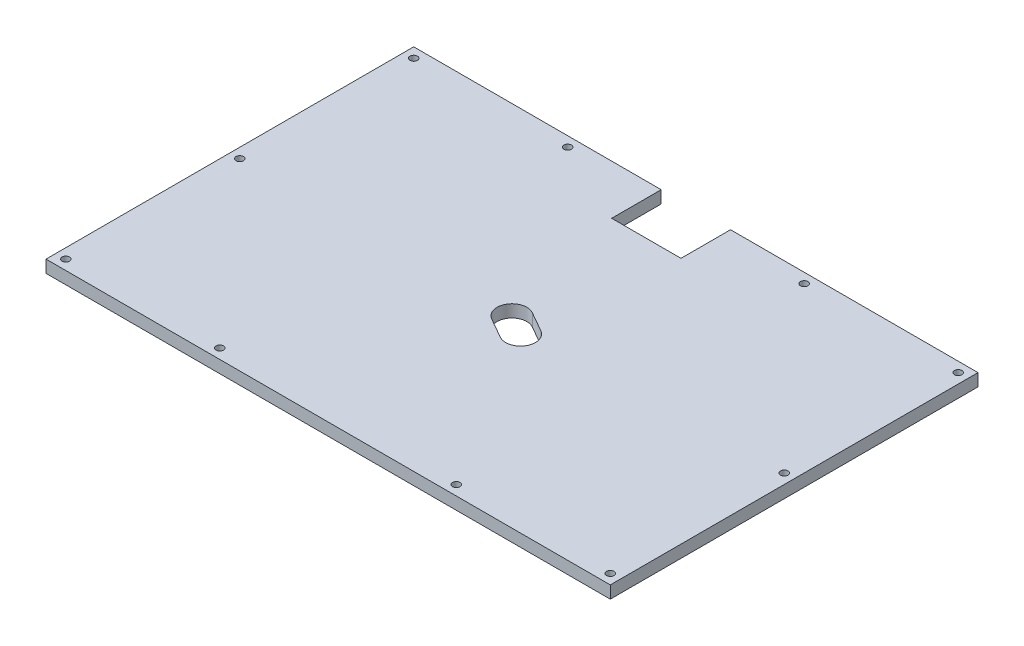
ISO-10303-21;
HEADER;
FILE_DESCRIPTION(('STEP AP214'),'2;1');
FILE_NAME('part.step','',(''),(''),'','','');
FILE_SCHEMA(('AUTOMOTIVE_DESIGN { 1 0 10303 214 1 1 1 1 }'));
ENDSEC;
DATA;
#1=APPLICATION_CONTEXT('core data for automotive mechanical design processes');
#2=APPLICATION_PROTOCOL_DEFINITION('international standard','automotive_design',2000,#1);
#3=PRODUCT_CONTEXT('',#1,'mechanical');
#4=PRODUCT('Part','Part','',(#3));
#5=PRODUCT_RELATED_PRODUCT_CATEGORY('part','',(#4));
#6=PRODUCT_DEFINITION_FORMATION('','',#4);
#7=PRODUCT_DEFINITION_CONTEXT('part definition',#1,'design');
#8=PRODUCT_DEFINITION('design','',#6,#7);
#9=PRODUCT_DEFINITION_SHAPE('','',#8);
#10=(LENGTH_UNIT() NAMED_UNIT(*) SI_UNIT(.MILLI.,.METRE.));
#11=(NAMED_UNIT(*) PLANE_ANGLE_UNIT() SI_UNIT($,.RADIAN.));
#12=(NAMED_UNIT(*) SI_UNIT($,.STERADIAN.) SOLID_ANGLE_UNIT());
#13=UNCERTAINTY_MEASURE_WITH_UNIT(LENGTH_MEASURE(1.E-05),#10,'distance_accuracy_value','');
#14=(GEOMETRIC_REPRESENTATION_CONTEXT(3) GLOBAL_UNCERTAINTY_ASSIGNED_CONTEXT((#13)) GLOBAL_UNIT_ASSIGNED_CONTEXT((#10,
#11,#12)) REPRESENTATION_CONTEXT('',''));
#15=CARTESIAN_POINT('',(0.,0.,0.));
#16=DIRECTION('',(0.,0.,1.));
#17=DIRECTION('',(1.,0.,0.));
#18=AXIS2_PLACEMENT_3D('',#15,#16,#17);
#19=CARTESIAN_POINT('',(227.86,5.,0.));
#20=DIRECTION('',(0.,-1.,0.));
#21=DIRECTION('',(0.,0.,-1.));
#22=AXIS2_PLACEMENT_3D('',#19,#20,#21);
#23=PLANE('',#22);
#24=CARTESIAN_POINT('',(3.99999999999996,5.,-144.48));
#25=DIRECTION('',(0.,1.,0.));
#26=DIRECTION('',(0.,0.,1.));
#27=AXIS2_PLACEMENT_3D('',#24,#25,#26);
#28=CIRCLE('',#27,1.49999999999996);
#29=CARTESIAN_POINT('',(3.99999999999996,5.,-142.98));
#30=VERTEX_POINT('',#29);
#31=EDGE_CURVE('E344',#30,#30,#28,.T.);
#32=ORIENTED_EDGE('',*,*,#31,.F.);
#33=EDGE_LOOP('',(#32));
#34=FACE_BOUND('',#33,.T.);
#35=CARTESIAN_POINT('',(223.86,5.,-4.00000000000011));
#36=DIRECTION('',(0.,1.,0.));
#37=DIRECTION('',(0.,0.,1.));
#38=AXIS2_PLACEMENT_3D('',#35,#36,#37);
#39=CIRCLE('',#38,1.49999999999986);
#40=CARTESIAN_POINT('',(223.86,5.,-2.50000000000025));
#41=VERTEX_POINT('',#40);
#42=EDGE_CURVE('E356',#41,#41,#39,.T.);
#43=ORIENTED_EDGE('',*,*,#42,.F.);
#44=EDGE_LOOP('',(#43));
#45=FACE_BOUND('',#44,.T.);
#46=CARTESIAN_POINT('',(161.68,5.,-144.48));
#47=DIRECTION('',(0.,1.,0.));
#48=DIRECTION('',(0.,0.,1.));
#49=AXIS2_PLACEMENT_3D('',#46,#47,#48);
#50=CIRCLE('',#49,1.5);
#51=CARTESIAN_POINT('',(161.68,5.,-142.98));
#52=VERTEX_POINT('',#51);
#53=EDGE_CURVE('E368',#52,#52,#50,.T.);
#54=ORIENTED_EDGE('',*,*,#53,.F.);
#55=EDGE_LOOP('',(#54));
#56=FACE_BOUND('',#55,.T.);
#57=CARTESIAN_POINT('',(66.18,5.,-4.00000000000006));
#58=DIRECTION('',(0.,1.,0.));
#59=DIRECTION('',(0.,0.,1.));
#60=AXIS2_PLACEMENT_3D('',#57,#58,#59);
#61=CIRCLE('',#60,1.50000000000003);
#62=CARTESIAN_POINT('',(66.18,5.,-2.50000000000003));
#63=VERTEX_POINT('',#62);
#64=EDGE_CURVE('E380',#63,#63,#61,.T.);
#65=ORIENTED_EDGE('',*,*,#64,.F.);
#66=EDGE_LOOP('',(#65));
#67=FACE_BOUND('',#66,.T.);
#68=CARTESIAN_POINT('',(223.86,5.,-74.2400000000001));
#69=DIRECTION('',(0.,1.,0.));
#70=DIRECTION('',(0.,0.,1.));
#71=AXIS2_PLACEMENT_3D('',#68,#69,#70);
#72=CIRCLE('',#71,1.49999999999985);
#73=CARTESIAN_POINT('',(223.86,5.,-72.7400000000002));
#74=VERTEX_POINT('',#73);
#75=EDGE_CURVE('E151',#74,#74,#72,.T.);
#76=ORIENTED_EDGE('',*,*,#75,.F.);
#77=EDGE_LOOP('',(#76));
#78=FACE_BOUND('',#77,.T.);
#79=DIRECTION('',(0.,0.,-1.));
#80=VECTOR('',#79,1.);
#81=CARTESIAN_POINT('',(227.86,5.,-148.48));
#82=LINE('',#81,#80);
#83=CARTESIAN_POINT('',(227.86,5.,0.));
#84=VERTEX_POINT('',#83);
#85=CARTESIAN_POINT('',(227.86,5.,-148.48));
#86=VERTEX_POINT('',#85);
#87=EDGE_CURVE('E161',#84,#86,#82,.T.);
#88=ORIENTED_EDGE('',*,*,#87,.T.);
#89=DIRECTION('',(-1.,0.,0.));
#90=VECTOR('',#89,1.);
#91=CARTESIAN_POINT('',(227.86,5.,-148.48));
#92=LINE('',#91,#90);
#93=CARTESIAN_POINT('',(127.93,5.,-148.48));
#94=VERTEX_POINT('',#93);
#95=EDGE_CURVE('E164',#86,#94,#92,.T.);
#96=ORIENTED_EDGE('',*,*,#95,.T.);
#97=DIRECTION('',(0.,0.,1.));
#98=VECTOR('',#97,1.);
#99=CARTESIAN_POINT('',(127.93,5.,-128.48));
#100=LINE('',#99,#98);
#101=CARTESIAN_POINT('',(127.93,5.,-128.48));
#102=VERTEX_POINT('',#101);
#103=EDGE_CURVE('E167',#94,#102,#100,.T.);
#104=ORIENTED_EDGE('',*,*,#103,.T.);
#105=DIRECTION('',(-1.,0.,0.));
#106=VECTOR('',#105,1.);
#107=CARTESIAN_POINT('',(99.93,5.,-128.48));
#108=LINE('',#107,#106);
#109=CARTESIAN_POINT('',(99.93,5.,-128.48));
#110=VERTEX_POINT('',#109);
#111=EDGE_CURVE('E169',#102,#110,#108,.T.);
#112=ORIENTED_EDGE('',*,*,#111,.T.);
#113=DIRECTION('',(0.,0.,-1.));
#114=VECTOR('',#113,1.);
#115=CARTESIAN_POINT('',(99.93,5.,-148.48));
#116=LINE('',#115,#114);
#117=CARTESIAN_POINT('',(99.93,5.,-148.48));
#118=VERTEX_POINT('',#117);
#119=EDGE_CURVE('E171',#110,#118,#116,.T.);
#120=ORIENTED_EDGE('',*,*,#119,.T.);
#121=DIRECTION('',(-1.,0.,0.));
#122=VECTOR('',#121,1.);
#123=CARTESIAN_POINT('',(99.93,5.,-148.48));
#124=LINE('',#123,#122);
#125=CARTESIAN_POINT('',(0.,5.,-148.48));
#126=VERTEX_POINT('',#125);
#127=EDGE_CURVE('E173',#118,#126,#124,.T.);
#128=ORIENTED_EDGE('',*,*,#127,.T.);
#129=DIRECTION('',(0.,0.,1.));
#130=VECTOR('',#129,1.);
#131=CARTESIAN_POINT('',(0.,5.,0.));
#132=LINE('',#131,#130);
#133=CARTESIAN_POINT('',(0.,5.,0.));
#134=VERTEX_POINT('',#133);
#135=EDGE_CURVE('E175',#126,#134,#132,.T.);
#136=ORIENTED_EDGE('',*,*,#135,.T.);
#137=DIRECTION('',(1.,0.,0.));
#138=VECTOR('',#137,1.);
#139=CARTESIAN_POINT('',(227.86,5.,0.));
#140=LINE('',#139,#138);
#141=EDGE_CURVE('E177',#134,#84,#140,.T.);
#142=ORIENTED_EDGE('',*,*,#141,.T.);
#143=EDGE_LOOP('',(#88,#96,#104,#112,#120,#128,#136,#142));
#144=FACE_BOUND('',#143,.T.);
#145=CARTESIAN_POINT('',(122.,5.,-69.6370000000001));
#146=DIRECTION('',(0.,1.,0.));
#147=DIRECTION('',(0.,0.,1.));
#148=AXIS2_PLACEMENT_3D('',#145,#146,#147);
#149=CIRCLE('',#148,5.99999999999997);
#150=CARTESIAN_POINT('',(119.027270761594,5.,-64.4251979244102));
#151=VERTEX_POINT('',#150);
#152=CARTESIAN_POINT('',(124.972729238406,5.,-74.8488020755901));
#153=VERTEX_POINT('',#152);
#154=EDGE_CURVE('E122',#151,#153,#149,.T.);
#155=ORIENTED_EDGE('',*,*,#154,.F.);
#156=DIRECTION('',(0.868633679264992,0.,0.495454873067733));
#157=VECTOR('',#156,1.);
#158=CARTESIAN_POINT('',(119.027270761594,5.,-64.4251979244102));
#159=LINE('',#158,#157);
#160=CARTESIAN_POINT('',(110.957270761594,5.,-69.0281979244101));
#161=VERTEX_POINT('',#160);
#162=EDGE_CURVE('E145',#161,#151,#159,.T.);
#163=ORIENTED_EDGE('',*,*,#162,.F.);
#164=CARTESIAN_POINT('',(113.93,5.,-74.24));
#165=DIRECTION('',(0.,1.,0.));
#166=DIRECTION('',(0.,0.,1.));
#167=AXIS2_PLACEMENT_3D('',#164,#165,#166);
#168=CIRCLE('',#167,5.99999999999998);
#169=CARTESIAN_POINT('',(116.902729238406,5.,-79.4518020755899));
#170=VERTEX_POINT('',#169);
#171=EDGE_CURVE('E143',#170,#161,#168,.T.);
#172=ORIENTED_EDGE('',*,*,#171,.F.);
#173=DIRECTION('',(-0.86863367926499,0.,-0.495454873067736));
#174=VECTOR('',#173,1.);
#175=CARTESIAN_POINT('',(124.972729238406,5.,-74.8488020755901));
#176=LINE('',#175,#174);
#177=EDGE_CURVE('E130',#153,#170,#176,.T.);
#178=ORIENTED_EDGE('',*,*,#177,.F.);
#179=EDGE_LOOP('',(#155,#163,#172,#178));
#180=FACE_BOUND('',#179,.T.);
#181=CARTESIAN_POINT('',(3.99999999999997,5.,-74.2400000000001));
#182=DIRECTION('',(0.,1.,0.));
#183=DIRECTION('',(0.,0.,-1.));
#184=AXIS2_PLACEMENT_3D('',#181,#182,#183);
#185=CIRCLE('',#184,1.49999999999995);
#186=CARTESIAN_POINT('',(3.99999999999997,5.,-75.74));
#187=VERTEX_POINT('',#186);
#188=EDGE_CURVE('E386',#187,#187,#185,.T.);
#189=ORIENTED_EDGE('',*,*,#188,.F.);
#190=EDGE_LOOP('',(#189));
#191=FACE_BOUND('',#190,.T.);
#192=CARTESIAN_POINT('',(161.68,5.,-4.00000000000011));
#193=DIRECTION('',(0.,1.,0.));
#194=DIRECTION('',(0.,0.,1.));
#195=AXIS2_PLACEMENT_3D('',#192,#193,#194);
#196=CIRCLE('',#195,1.50000000000001);
#197=CARTESIAN_POINT('',(161.68,5.,-2.5000000000001));
#198=VERTEX_POINT('',#197);
#199=EDGE_CURVE('E374',#198,#198,#196,.T.);
#200=ORIENTED_EDGE('',*,*,#199,.F.);
#201=EDGE_LOOP('',(#200));
#202=FACE_BOUND('',#201,.T.);
#203=CARTESIAN_POINT('',(66.18,5.,-144.48));
#204=DIRECTION('',(0.,1.,0.));
#205=DIRECTION('',(0.,0.,1.));
#206=AXIS2_PLACEMENT_3D('',#203,#204,#205);
#207=CIRCLE('',#206,1.50000000000001);
#208=CARTESIAN_POINT('',(66.18,5.,-142.98));
#209=VERTEX_POINT('',#208);
#210=EDGE_CURVE('E362',#209,#209,#207,.T.);
#211=ORIENTED_EDGE('',*,*,#210,.F.);
#212=EDGE_LOOP('',(#211));
#213=FACE_BOUND('',#212,.T.);
#214=CARTESIAN_POINT('',(3.99999999999998,5.,-4.00000000000011));
#215=DIRECTION('',(0.,1.,0.));
#216=DIRECTION('',(0.,0.,-1.));
#217=AXIS2_PLACEMENT_3D('',#214,#215,#216);
#218=CIRCLE('',#217,1.49999999999996);
#219=CARTESIAN_POINT('',(3.99999999999998,5.,-5.50000000000007));
#220=VERTEX_POINT('',#219);
#221=EDGE_CURVE('E350',#220,#220,#218,.T.);
#222=ORIENTED_EDGE('',*,*,#221,.F.);
#223=EDGE_LOOP('',(#222));
#224=FACE_BOUND('',#223,.T.);
#225=CARTESIAN_POINT('',(223.86,5.,-144.48));
#226=DIRECTION('',(0.,1.,0.));
#227=DIRECTION('',(0.,0.,-1.));
#228=AXIS2_PLACEMENT_3D('',#225,#226,#227);
#229=CIRCLE('',#228,1.49999999999984);
#230=CARTESIAN_POINT('',(223.86,5.,-145.98));
#231=VERTEX_POINT('',#230);
#232=EDGE_CURVE('E335',#231,#231,#229,.T.);
#233=ORIENTED_EDGE('',*,*,#232,.F.);
#234=EDGE_LOOP('',(#233));
#235=FACE_BOUND('',#234,.T.);
#236=ADVANCED_FACE('F33',(#34,#45,#56,#67,#78,#144,#180,#191,#202,#213,#224,#235),#23,.F.);
#237=CARTESIAN_POINT('',(227.86,0.,0.));
#238=DIRECTION('',(0.,-1.,0.));
#239=DIRECTION('',(0.,0.,-1.));
#240=AXIS2_PLACEMENT_3D('',#237,#238,#239);
#241=PLANE('',#240);
#242=CARTESIAN_POINT('',(3.99999999999996,0.,-144.48));
#243=DIRECTION('',(0.,1.,0.));
#244=DIRECTION('',(0.,0.,1.));
#245=AXIS2_PLACEMENT_3D('',#242,#243,#244);
#246=CIRCLE('',#245,1.49999999999996);
#247=CARTESIAN_POINT('',(3.99999999999996,0.,-142.98));
#248=VERTEX_POINT('',#247);
#249=EDGE_CURVE('E341',#248,#248,#246,.T.);
#250=ORIENTED_EDGE('',*,*,#249,.T.);
#251=EDGE_LOOP('',(#250));
#252=FACE_BOUND('',#251,.T.);
#253=CARTESIAN_POINT('',(223.86,0.,-4.00000000000011));
#254=DIRECTION('',(0.,1.,0.));
#255=DIRECTION('',(0.,0.,1.));
#256=AXIS2_PLACEMENT_3D('',#253,#254,#255);
#257=CIRCLE('',#256,1.49999999999986);
#258=CARTESIAN_POINT('',(223.86,0.,-2.50000000000025));
#259=VERTEX_POINT('',#258);
#260=EDGE_CURVE('E353',#259,#259,#257,.T.);
#261=ORIENTED_EDGE('',*,*,#260,.T.);
#262=EDGE_LOOP('',(#261));
#263=FACE_BOUND('',#262,.T.);
#264=CARTESIAN_POINT('',(161.68,0.,-144.48));
#265=DIRECTION('',(0.,1.,0.));
#266=DIRECTION('',(0.,0.,1.));
#267=AXIS2_PLACEMENT_3D('',#264,#265,#266);
#268=CIRCLE('',#267,1.5);
#269=CARTESIAN_POINT('',(161.68,0.,-142.98));
#270=VERTEX_POINT('',#269);
#271=EDGE_CURVE('E365',#270,#270,#268,.T.);
#272=ORIENTED_EDGE('',*,*,#271,.T.);
#273=EDGE_LOOP('',(#272));
#274=FACE_BOUND('',#273,.T.);
#275=CARTESIAN_POINT('',(66.18,0.,-4.00000000000006));
#276=DIRECTION('',(0.,1.,0.));
#277=DIRECTION('',(0.,0.,1.));
#278=AXIS2_PLACEMENT_3D('',#275,#276,#277);
#279=CIRCLE('',#278,1.50000000000003);
#280=CARTESIAN_POINT('',(66.18,0.,-2.50000000000003));
#281=VERTEX_POINT('',#280);
#282=EDGE_CURVE('E377',#281,#281,#279,.T.);
#283=ORIENTED_EDGE('',*,*,#282,.T.);
#284=EDGE_LOOP('',(#283));
#285=FACE_BOUND('',#284,.T.);
#286=CARTESIAN_POINT('',(223.86,0.,-74.2400000000001));
#287=DIRECTION('',(0.,1.,0.));
#288=DIRECTION('',(0.,0.,1.));
#289=AXIS2_PLACEMENT_3D('',#286,#287,#288);
#290=CIRCLE('',#289,1.49999999999985);
#291=CARTESIAN_POINT('',(223.86,0.,-72.7400000000002));
#292=VERTEX_POINT('',#291);
#293=EDGE_CURVE('E389',#292,#292,#290,.T.);
#294=ORIENTED_EDGE('',*,*,#293,.T.);
#295=EDGE_LOOP('',(#294));
#296=FACE_BOUND('',#295,.T.);
#297=DIRECTION('',(0.,0.,-1.));
#298=VECTOR('',#297,1.);
#299=CARTESIAN_POINT('',(227.86,0.,-148.48));
#300=LINE('',#299,#298);
#301=CARTESIAN_POINT('',(227.86,0.,0.));
#302=VERTEX_POINT('',#301);
#303=CARTESIAN_POINT('',(227.86,0.,-148.48));
#304=VERTEX_POINT('',#303);
#305=EDGE_CURVE('E138',#302,#304,#300,.T.);
#306=ORIENTED_EDGE('',*,*,#305,.F.);
#307=DIRECTION('',(1.,0.,0.));
#308=VECTOR('',#307,1.);
#309=CARTESIAN_POINT('',(227.86,0.,0.));
#310=LINE('',#309,#308);
#311=CARTESIAN_POINT('',(0.,0.,0.));
#312=VERTEX_POINT('',#311);
#313=EDGE_CURVE('E165',#312,#302,#310,.T.);
#314=ORIENTED_EDGE('',*,*,#313,.F.);
#315=DIRECTION('',(0.,0.,1.));
#316=VECTOR('',#315,1.);
#317=CARTESIAN_POINT('',(0.,0.,0.));
#318=LINE('',#317,#316);
#319=CARTESIAN_POINT('',(0.,0.,-148.48));
#320=VERTEX_POINT('',#319);
#321=EDGE_CURVE('E192',#320,#312,#318,.T.);
#322=ORIENTED_EDGE('',*,*,#321,.F.);
#323=DIRECTION('',(-1.,0.,0.));
#324=VECTOR('',#323,1.);
#325=CARTESIAN_POINT('',(99.93,0.,-148.48));
#326=LINE('',#325,#324);
#327=CARTESIAN_POINT('',(99.93,0.,-148.48));
#328=VERTEX_POINT('',#327);
#329=EDGE_CURVE('E190',#328,#320,#326,.T.);
#330=ORIENTED_EDGE('',*,*,#329,.F.);
#331=DIRECTION('',(0.,0.,-1.));
#332=VECTOR('',#331,1.);
#333=CARTESIAN_POINT('',(99.93,0.,-148.48));
#334=LINE('',#333,#332);
#335=CARTESIAN_POINT('',(99.93,0.,-128.48));
#336=VERTEX_POINT('',#335);
#337=EDGE_CURVE('E188',#336,#328,#334,.T.);
#338=ORIENTED_EDGE('',*,*,#337,.F.);
#339=DIRECTION('',(-1.,0.,0.));
#340=VECTOR('',#339,1.);
#341=CARTESIAN_POINT('',(99.93,0.,-128.48));
#342=LINE('',#341,#340);
#343=CARTESIAN_POINT('',(127.93,0.,-128.48));
#344=VERTEX_POINT('',#343);
#345=EDGE_CURVE('E186',#344,#336,#342,.T.);
#346=ORIENTED_EDGE('',*,*,#345,.F.);
#347=DIRECTION('',(0.,0.,1.));
#348=VECTOR('',#347,1.);
#349=CARTESIAN_POINT('',(127.93,0.,-128.48));
#350=LINE('',#349,#348);
#351=CARTESIAN_POINT('',(127.93,0.,-148.48));
#352=VERTEX_POINT('',#351);
#353=EDGE_CURVE('E184',#352,#344,#350,.T.);
#354=ORIENTED_EDGE('',*,*,#353,.F.);
#355=DIRECTION('',(-1.,0.,0.));
#356=VECTOR('',#355,1.);
#357=CARTESIAN_POINT('',(227.86,0.,-148.48));
#358=LINE('',#357,#356);
#359=EDGE_CURVE('E182',#304,#352,#358,.T.);
#360=ORIENTED_EDGE('',*,*,#359,.F.);
#361=EDGE_LOOP('',(#306,#314,#322,#330,#338,#346,#354,#360));
#362=FACE_BOUND('',#361,.T.);
#363=DIRECTION('',(0.868633679264992,0.,0.495454873067733));
#364=VECTOR('',#363,1.);
#365=CARTESIAN_POINT('',(119.027270761594,0.,-64.4251979244102));
#366=LINE('',#365,#364);
#367=CARTESIAN_POINT('',(110.957270761594,0.,-69.0281979244101));
#368=VERTEX_POINT('',#367);
#369=CARTESIAN_POINT('',(119.027270761594,0.,-64.4251979244102));
#370=VERTEX_POINT('',#369);
#371=EDGE_CURVE('E131',#368,#370,#366,.T.);
#372=ORIENTED_EDGE('',*,*,#371,.T.);
#373=CARTESIAN_POINT('',(122.,0.,-69.6370000000001));
#374=DIRECTION('',(0.,1.,0.));
#375=DIRECTION('',(0.,0.,1.));
#376=AXIS2_PLACEMENT_3D('',#373,#374,#375);
#377=CIRCLE('',#376,5.99999999999997);
#378=CARTESIAN_POINT('',(124.972729238406,0.,-74.8488020755901));
#379=VERTEX_POINT('',#378);
#380=EDGE_CURVE('E56',#370,#379,#377,.T.);
#381=ORIENTED_EDGE('',*,*,#380,.T.);
#382=DIRECTION('',(-0.86863367926499,0.,-0.495454873067736));
#383=VECTOR('',#382,1.);
#384=CARTESIAN_POINT('',(124.972729238406,0.,-74.8488020755901));
#385=LINE('',#384,#383);
#386=CARTESIAN_POINT('',(116.902729238406,0.,-79.4518020755899));
#387=VERTEX_POINT('',#386);
#388=EDGE_CURVE('E137',#379,#387,#385,.T.);
#389=ORIENTED_EDGE('',*,*,#388,.T.);
#390=CARTESIAN_POINT('',(113.93,0.,-74.24));
#391=DIRECTION('',(0.,1.,0.));
#392=DIRECTION('',(0.,0.,1.));
#393=AXIS2_PLACEMENT_3D('',#390,#391,#392);
#394=CIRCLE('',#393,5.99999999999998);
#395=EDGE_CURVE('E153',#387,#368,#394,.T.);
#396=ORIENTED_EDGE('',*,*,#395,.T.);
#397=EDGE_LOOP('',(#372,#381,#389,#396));
#398=FACE_BOUND('',#397,.T.);
#399=CARTESIAN_POINT('',(3.99999999999997,0.,-74.2400000000001));
#400=DIRECTION('',(0.,1.,0.));
#401=DIRECTION('',(0.,0.,-1.));
#402=AXIS2_PLACEMENT_3D('',#399,#400,#401);
#403=CIRCLE('',#402,1.49999999999995);
#404=CARTESIAN_POINT('',(3.99999999999997,0.,-75.74));
#405=VERTEX_POINT('',#404);
#406=EDGE_CURVE('E383',#405,#405,#403,.T.);
#407=ORIENTED_EDGE('',*,*,#406,.T.);
#408=EDGE_LOOP('',(#407));
#409=FACE_BOUND('',#408,.T.);
#410=CARTESIAN_POINT('',(161.68,0.,-4.00000000000011));
#411=DIRECTION('',(0.,1.,0.));
#412=DIRECTION('',(0.,0.,1.));
#413=AXIS2_PLACEMENT_3D('',#410,#411,#412);
#414=CIRCLE('',#413,1.50000000000001);
#415=CARTESIAN_POINT('',(161.68,0.,-2.5000000000001));
#416=VERTEX_POINT('',#415);
#417=EDGE_CURVE('E371',#416,#416,#414,.T.);
#418=ORIENTED_EDGE('',*,*,#417,.T.);
#419=EDGE_LOOP('',(#418));
#420=FACE_BOUND('',#419,.T.);
#421=CARTESIAN_POINT('',(66.18,0.,-144.48));
#422=DIRECTION('',(0.,1.,0.));
#423=DIRECTION('',(0.,0.,1.));
#424=AXIS2_PLACEMENT_3D('',#421,#422,#423);
#425=CIRCLE('',#424,1.50000000000001);
#426=CARTESIAN_POINT('',(66.18,0.,-142.98));
#427=VERTEX_POINT('',#426);
#428=EDGE_CURVE('E359',#427,#427,#425,.T.);
#429=ORIENTED_EDGE('',*,*,#428,.T.);
#430=EDGE_LOOP('',(#429));
#431=FACE_BOUND('',#430,.T.);
#432=CARTESIAN_POINT('',(3.99999999999998,0.,-4.00000000000011));
#433=DIRECTION('',(0.,1.,0.));
#434=DIRECTION('',(0.,0.,-1.));
#435=AXIS2_PLACEMENT_3D('',#432,#433,#434);
#436=CIRCLE('',#435,1.49999999999996);
#437=CARTESIAN_POINT('',(3.99999999999998,0.,-5.50000000000007));
#438=VERTEX_POINT('',#437);
#439=EDGE_CURVE('E347',#438,#438,#436,.T.);
#440=ORIENTED_EDGE('',*,*,#439,.T.);
#441=EDGE_LOOP('',(#440));
#442=FACE_BOUND('',#441,.T.);
#443=CARTESIAN_POINT('',(223.86,0.,-144.48));
#444=DIRECTION('',(0.,1.,0.));
#445=DIRECTION('',(0.,0.,-1.));
#446=AXIS2_PLACEMENT_3D('',#443,#444,#445);
#447=CIRCLE('',#446,1.49999999999984);
#448=CARTESIAN_POINT('',(223.86,0.,-145.98));
#449=VERTEX_POINT('',#448);
#450=EDGE_CURVE('E338',#449,#449,#447,.T.);
#451=ORIENTED_EDGE('',*,*,#450,.T.);
#452=EDGE_LOOP('',(#451));
#453=FACE_BOUND('',#452,.T.);
#454=ADVANCED_FACE('F222',(#252,#263,#274,#285,#296,#362,#398,#409,#420,#431,#442,#453),#241,.T.);
#455=CARTESIAN_POINT('',(227.86,5.,-148.48));
#456=DIRECTION('',(-1.,0.,0.));
#457=DIRECTION('',(0.,0.,1.));
#458=AXIS2_PLACEMENT_3D('',#455,#456,#457);
#459=PLANE('',#458);
#460=ORIENTED_EDGE('',*,*,#305,.T.);
#461=DIRECTION('',(0.,-1.,0.));
#462=VECTOR('',#461,1.);
#463=CARTESIAN_POINT('',(227.86,5.,-148.48));
#464=LINE('',#463,#462);
#465=EDGE_CURVE('E11',#86,#304,#464,.T.);
#466=ORIENTED_EDGE('',*,*,#465,.F.);
#467=ORIENTED_EDGE('',*,*,#87,.F.);
#468=DIRECTION('',(0.,-1.,0.));
#469=VECTOR('',#468,1.);
#470=CARTESIAN_POINT('',(227.86,5.,0.));
#471=LINE('',#470,#469);
#472=EDGE_CURVE('E179',#84,#302,#471,.T.);
#473=ORIENTED_EDGE('',*,*,#472,.T.);
#474=EDGE_LOOP('',(#460,#466,#467,#473));
#475=FACE_BOUND('',#474,.T.);
#476=ADVANCED_FACE('F35',(#475),#459,.F.);
#477=CARTESIAN_POINT('',(227.86,5.,-148.48));
#478=DIRECTION('',(0.,0.,1.));
#479=DIRECTION('',(1.,0.,0.));
#480=AXIS2_PLACEMENT_3D('',#477,#478,#479);
#481=PLANE('',#480);
#482=ORIENTED_EDGE('',*,*,#359,.T.);
#483=DIRECTION('',(0.,-1.,0.));
#484=VECTOR('',#483,1.);
#485=CARTESIAN_POINT('',(127.93,5.,-148.48));
#486=LINE('',#485,#484);
#487=EDGE_CURVE('E41',#94,#352,#486,.T.);
#488=ORIENTED_EDGE('',*,*,#487,.F.);
#489=ORIENTED_EDGE('',*,*,#95,.F.);
#490=ORIENTED_EDGE('',*,*,#465,.T.);
#491=EDGE_LOOP('',(#482,#488,#489,#490));
#492=FACE_BOUND('',#491,.T.);
#493=ADVANCED_FACE('F239',(#492),#481,.F.);
#494=CARTESIAN_POINT('',(127.93,5.,-128.48));
#495=DIRECTION('',(1.,0.,0.));
#496=DIRECTION('',(0.,0.,-1.));
#497=AXIS2_PLACEMENT_3D('',#494,#495,#496);
#498=PLANE('',#497);
#499=ORIENTED_EDGE('',*,*,#353,.T.);
#500=DIRECTION('',(0.,-1.,0.));
#501=VECTOR('',#500,1.);
#502=CARTESIAN_POINT('',(127.93,5.,-128.48));
#503=LINE('',#502,#501);
#504=EDGE_CURVE('E209',#102,#344,#503,.T.);
#505=ORIENTED_EDGE('',*,*,#504,.F.);
#506=ORIENTED_EDGE('',*,*,#103,.F.);
#507=ORIENTED_EDGE('',*,*,#487,.T.);
#508=EDGE_LOOP('',(#499,#505,#506,#507));
#509=FACE_BOUND('',#508,.T.);
#510=ADVANCED_FACE('F216',(#509),#498,.F.);
#511=CARTESIAN_POINT('',(99.93,5.,-128.48));
#512=DIRECTION('',(0.,0.,1.));
#513=DIRECTION('',(1.,0.,0.));
#514=AXIS2_PLACEMENT_3D('',#511,#512,#513);
#515=PLANE('',#514);
#516=ORIENTED_EDGE('',*,*,#345,.T.);
#517=DIRECTION('',(0.,-1.,0.));
#518=VECTOR('',#517,1.);
#519=CARTESIAN_POINT('',(99.93,5.,-128.48));
#520=LINE('',#519,#518);
#521=EDGE_CURVE('E206',#110,#336,#520,.T.);
#522=ORIENTED_EDGE('',*,*,#521,.F.);
#523=ORIENTED_EDGE('',*,*,#111,.F.);
#524=ORIENTED_EDGE('',*,*,#504,.T.);
#525=EDGE_LOOP('',(#516,#522,#523,#524));
#526=FACE_BOUND('',#525,.T.);
#527=ADVANCED_FACE('F228',(#526),#515,.F.);
#528=CARTESIAN_POINT('',(99.93,5.,-148.48));
#529=DIRECTION('',(-1.,0.,0.));
#530=DIRECTION('',(0.,0.,1.));
#531=AXIS2_PLACEMENT_3D('',#528,#529,#530);
#532=PLANE('',#531);
#533=ORIENTED_EDGE('',*,*,#337,.T.);
#534=DIRECTION('',(0.,-1.,0.));
#535=VECTOR('',#534,1.);
#536=CARTESIAN_POINT('',(99.93,5.,-148.48));
#537=LINE('',#536,#535);
#538=EDGE_CURVE('E203',#118,#328,#537,.T.);
#539=ORIENTED_EDGE('',*,*,#538,.F.);
#540=ORIENTED_EDGE('',*,*,#119,.F.);
#541=ORIENTED_EDGE('',*,*,#521,.T.);
#542=EDGE_LOOP('',(#533,#539,#540,#541));
#543=FACE_BOUND('',#542,.T.);
#544=ADVANCED_FACE('F232',(#543),#532,.F.);
#545=CARTESIAN_POINT('',(99.93,5.,-148.48));
#546=DIRECTION('',(0.,0.,1.));
#547=DIRECTION('',(1.,0.,0.));
#548=AXIS2_PLACEMENT_3D('',#545,#546,#547);
#549=PLANE('',#548);
#550=ORIENTED_EDGE('',*,*,#329,.T.);
#551=DIRECTION('',(0.,-1.,0.));
#552=VECTOR('',#551,1.);
#553=CARTESIAN_POINT('',(0.,5.,-148.48));
#554=LINE('',#553,#552);
#555=EDGE_CURVE('E200',#126,#320,#554,.T.);
#556=ORIENTED_EDGE('',*,*,#555,.F.);
#557=ORIENTED_EDGE('',*,*,#127,.F.);
#558=ORIENTED_EDGE('',*,*,#538,.T.);
#559=EDGE_LOOP('',(#550,#556,#557,#558));
#560=FACE_BOUND('',#559,.T.);
#561=ADVANCED_FACE('F252',(#560),#549,.F.);
#562=CARTESIAN_POINT('',(0.,5.,0.));
#563=DIRECTION('',(1.,0.,0.));
#564=DIRECTION('',(0.,0.,-1.));
#565=AXIS2_PLACEMENT_3D('',#562,#563,#564);
#566=PLANE('',#565);
#567=ORIENTED_EDGE('',*,*,#321,.T.);
#568=DIRECTION('',(0.,-1.,0.));
#569=VECTOR('',#568,1.);
#570=CARTESIAN_POINT('',(0.,5.,0.));
#571=LINE('',#570,#569);
#572=EDGE_CURVE('E197',#134,#312,#571,.T.);
#573=ORIENTED_EDGE('',*,*,#572,.F.);
#574=ORIENTED_EDGE('',*,*,#135,.F.);
#575=ORIENTED_EDGE('',*,*,#555,.T.);
#576=EDGE_LOOP('',(#567,#573,#574,#575));
#577=FACE_BOUND('',#576,.T.);
#578=ADVANCED_FACE('F250',(#577),#566,.F.);
#579=CARTESIAN_POINT('',(227.86,5.,0.));
#580=DIRECTION('',(0.,0.,-1.));
#581=DIRECTION('',(-1.,0.,0.));
#582=AXIS2_PLACEMENT_3D('',#579,#580,#581);
#583=PLANE('',#582);
#584=ORIENTED_EDGE('',*,*,#313,.T.);
#585=ORIENTED_EDGE('',*,*,#472,.F.);
#586=ORIENTED_EDGE('',*,*,#141,.F.);
#587=ORIENTED_EDGE('',*,*,#572,.T.);
#588=EDGE_LOOP('',(#584,#585,#586,#587));
#589=FACE_BOUND('',#588,.T.);
#590=ADVANCED_FACE('F245',(#589),#583,.F.);
#591=CARTESIAN_POINT('',(122.,5.,-69.6370000000001));
#592=DIRECTION('',(0.,-1.,0.));
#593=DIRECTION('',(0.,0.,-1.));
#594=AXIS2_PLACEMENT_3D('',#591,#592,#593);
#595=CYLINDRICAL_SURFACE('',#594,5.99999999999997);
#596=ORIENTED_EDGE('',*,*,#380,.F.);
#597=DIRECTION('',(0.,-1.,0.));
#598=VECTOR('',#597,1.);
#599=CARTESIAN_POINT('',(119.027270761594,5.,-64.4251979244102));
#600=LINE('',#599,#598);
#601=EDGE_CURVE('E126',#151,#370,#600,.T.);
#602=ORIENTED_EDGE('',*,*,#601,.F.);
#603=ORIENTED_EDGE('',*,*,#154,.T.);
#604=DIRECTION('',(0.,-1.,0.));
#605=VECTOR('',#604,1.);
#606=CARTESIAN_POINT('',(124.972729238406,5.,-74.8488020755901));
#607=LINE('',#606,#605);
#608=EDGE_CURVE('E125',#153,#379,#607,.T.);
#609=ORIENTED_EDGE('',*,*,#608,.T.);
#610=EDGE_LOOP('',(#596,#602,#603,#609));
#611=FACE_BOUND('',#610,.T.);
#612=ADVANCED_FACE('F124',(#611),#595,.F.);
#613=CARTESIAN_POINT('',(124.972729238406,5.,-74.8488020755901));
#614=DIRECTION('',(-0.495454873067736,0.,0.86863367926499));
#615=DIRECTION('',(0.86863367926499,0.,0.495454873067736));
#616=AXIS2_PLACEMENT_3D('',#613,#614,#615);
#617=PLANE('',#616);
#618=ORIENTED_EDGE('',*,*,#388,.F.);
#619=ORIENTED_EDGE('',*,*,#608,.F.);
#620=ORIENTED_EDGE('',*,*,#177,.T.);
#621=DIRECTION('',(0.,-1.,0.));
#622=VECTOR('',#621,1.);
#623=CARTESIAN_POINT('',(116.902729238406,5.,-79.4518020755899));
#624=LINE('',#623,#622);
#625=EDGE_CURVE('E139',#170,#387,#624,.T.);
#626=ORIENTED_EDGE('',*,*,#625,.T.);
#627=EDGE_LOOP('',(#618,#619,#620,#626));
#628=FACE_BOUND('',#627,.T.);
#629=ADVANCED_FACE('F134',(#628),#617,.T.);
#630=CARTESIAN_POINT('',(113.93,5.,-74.24));
#631=DIRECTION('',(0.,-1.,0.));
#632=DIRECTION('',(0.,0.,-1.));
#633=AXIS2_PLACEMENT_3D('',#630,#631,#632);
#634=CYLINDRICAL_SURFACE('',#633,5.99999999999998);
#635=ORIENTED_EDGE('',*,*,#395,.F.);
#636=ORIENTED_EDGE('',*,*,#625,.F.);
#637=ORIENTED_EDGE('',*,*,#171,.T.);
#638=DIRECTION('',(0.,-1.,0.));
#639=VECTOR('',#638,1.);
#640=CARTESIAN_POINT('',(110.957270761594,5.,-69.0281979244101));
#641=LINE('',#640,#639);
#642=EDGE_CURVE('E48',#161,#368,#641,.T.);
#643=ORIENTED_EDGE('',*,*,#642,.T.);
#644=EDGE_LOOP('',(#635,#636,#637,#643));
#645=FACE_BOUND('',#644,.T.);
#646=ADVANCED_FACE('F281',(#645),#634,.F.);
#647=CARTESIAN_POINT('',(119.027270761594,5.,-64.4251979244102));
#648=DIRECTION('',(0.495454873067733,0.,-0.868633679264992));
#649=DIRECTION('',(-0.868633679264992,0.,-0.495454873067733));
#650=AXIS2_PLACEMENT_3D('',#647,#648,#649);
#651=PLANE('',#650);
#652=ORIENTED_EDGE('',*,*,#371,.F.);
#653=ORIENTED_EDGE('',*,*,#642,.F.);
#654=ORIENTED_EDGE('',*,*,#162,.T.);
#655=ORIENTED_EDGE('',*,*,#601,.T.);
#656=EDGE_LOOP('',(#652,#653,#654,#655));
#657=FACE_BOUND('',#656,.T.);
#658=ADVANCED_FACE('F285',(#657),#651,.T.);
#659=CARTESIAN_POINT('',(223.86,5.,-74.2400000000001));
#660=DIRECTION('',(0.,-1.,0.));
#661=DIRECTION('',(0.,0.,-1.));
#662=AXIS2_PLACEMENT_3D('',#659,#660,#661);
#663=CYLINDRICAL_SURFACE('',#662,1.49999999999985);
#664=ORIENTED_EDGE('',*,*,#75,.T.);
#665=EDGE_LOOP('',(#664));
#666=FACE_BOUND('',#665,.T.);
#667=ORIENTED_EDGE('',*,*,#293,.F.);
#668=EDGE_LOOP('',(#667));
#669=FACE_BOUND('',#668,.T.);
#670=ADVANCED_FACE('F291',(#666,#669),#663,.F.);
#671=CARTESIAN_POINT('',(3.99999999999997,5.,-74.2400000000001));
#672=DIRECTION('',(0.,-1.,0.));
#673=DIRECTION('',(0.,0.,-1.));
#674=AXIS2_PLACEMENT_3D('',#671,#672,#673);
#675=CYLINDRICAL_SURFACE('',#674,1.49999999999995);
#676=ORIENTED_EDGE('',*,*,#188,.T.);
#677=EDGE_LOOP('',(#676));
#678=FACE_BOUND('',#677,.T.);
#679=ORIENTED_EDGE('',*,*,#406,.F.);
#680=EDGE_LOOP('',(#679));
#681=FACE_BOUND('',#680,.T.);
#682=ADVANCED_FACE('F294',(#678,#681),#675,.F.);
#683=CARTESIAN_POINT('',(66.18,5.,-4.00000000000006));
#684=DIRECTION('',(0.,-1.,0.));
#685=DIRECTION('',(0.,0.,-1.));
#686=AXIS2_PLACEMENT_3D('',#683,#684,#685);
#687=CYLINDRICAL_SURFACE('',#686,1.50000000000003);
#688=ORIENTED_EDGE('',*,*,#64,.T.);
#689=EDGE_LOOP('',(#688));
#690=FACE_BOUND('',#689,.T.);
#691=ORIENTED_EDGE('',*,*,#282,.F.);
#692=EDGE_LOOP('',(#691));
#693=FACE_BOUND('',#692,.T.);
#694=ADVANCED_FACE('F298',(#690,#693),#687,.F.);
#695=CARTESIAN_POINT('',(161.68,5.,-4.00000000000011));
#696=DIRECTION('',(0.,-1.,0.));
#697=DIRECTION('',(0.,0.,-1.));
#698=AXIS2_PLACEMENT_3D('',#695,#696,#697);
#699=CYLINDRICAL_SURFACE('',#698,1.50000000000001);
#700=ORIENTED_EDGE('',*,*,#199,.T.);
#701=EDGE_LOOP('',(#700));
#702=FACE_BOUND('',#701,.T.);
#703=ORIENTED_EDGE('',*,*,#417,.F.);
#704=EDGE_LOOP('',(#703));
#705=FACE_BOUND('',#704,.T.);
#706=ADVANCED_FACE('F302',(#702,#705),#699,.F.);
#707=CARTESIAN_POINT('',(161.68,5.,-144.48));
#708=DIRECTION('',(0.,-1.,0.));
#709=DIRECTION('',(0.,0.,-1.));
#710=AXIS2_PLACEMENT_3D('',#707,#708,#709);
#711=CYLINDRICAL_SURFACE('',#710,1.5);
#712=ORIENTED_EDGE('',*,*,#53,.T.);
#713=EDGE_LOOP('',(#712));
#714=FACE_BOUND('',#713,.T.);
#715=ORIENTED_EDGE('',*,*,#271,.F.);
#716=EDGE_LOOP('',(#715));
#717=FACE_BOUND('',#716,.T.);
#718=ADVANCED_FACE('F306',(#714,#717),#711,.F.);
#719=CARTESIAN_POINT('',(66.18,5.,-144.48));
#720=DIRECTION('',(0.,-1.,0.));
#721=DIRECTION('',(0.,0.,-1.));
#722=AXIS2_PLACEMENT_3D('',#719,#720,#721);
#723=CYLINDRICAL_SURFACE('',#722,1.50000000000001);
#724=ORIENTED_EDGE('',*,*,#210,.T.);
#725=EDGE_LOOP('',(#724));
#726=FACE_BOUND('',#725,.T.);
#727=ORIENTED_EDGE('',*,*,#428,.F.);
#728=EDGE_LOOP('',(#727));
#729=FACE_BOUND('',#728,.T.);
#730=ADVANCED_FACE('F310',(#726,#729),#723,.F.);
#731=CARTESIAN_POINT('',(223.86,5.,-4.00000000000011));
#732=DIRECTION('',(0.,-1.,0.));
#733=DIRECTION('',(0.,0.,-1.));
#734=AXIS2_PLACEMENT_3D('',#731,#732,#733);
#735=CYLINDRICAL_SURFACE('',#734,1.49999999999986);
#736=ORIENTED_EDGE('',*,*,#42,.T.);
#737=EDGE_LOOP('',(#736));
#738=FACE_BOUND('',#737,.T.);
#739=ORIENTED_EDGE('',*,*,#260,.F.);
#740=EDGE_LOOP('',(#739));
#741=FACE_BOUND('',#740,.T.);
#742=ADVANCED_FACE('F314',(#738,#741),#735,.F.);
#743=CARTESIAN_POINT('',(3.99999999999998,5.,-4.00000000000011));
#744=DIRECTION('',(0.,-1.,0.));
#745=DIRECTION('',(0.,0.,-1.));
#746=AXIS2_PLACEMENT_3D('',#743,#744,#745);
#747=CYLINDRICAL_SURFACE('',#746,1.49999999999996);
#748=ORIENTED_EDGE('',*,*,#221,.T.);
#749=EDGE_LOOP('',(#748));
#750=FACE_BOUND('',#749,.T.);
#751=ORIENTED_EDGE('',*,*,#439,.F.);
#752=EDGE_LOOP('',(#751));
#753=FACE_BOUND('',#752,.T.);
#754=ADVANCED_FACE('F318',(#750,#753),#747,.F.);
#755=CARTESIAN_POINT('',(3.99999999999996,5.,-144.48));
#756=DIRECTION('',(0.,-1.,0.));
#757=DIRECTION('',(0.,0.,-1.));
#758=AXIS2_PLACEMENT_3D('',#755,#756,#757);
#759=CYLINDRICAL_SURFACE('',#758,1.49999999999996);
#760=ORIENTED_EDGE('',*,*,#31,.T.);
#761=EDGE_LOOP('',(#760));
#762=FACE_BOUND('',#761,.T.);
#763=ORIENTED_EDGE('',*,*,#249,.F.);
#764=EDGE_LOOP('',(#763));
#765=FACE_BOUND('',#764,.T.);
#766=ADVANCED_FACE('F322',(#762,#765),#759,.F.);
#767=CARTESIAN_POINT('',(223.86,5.,-144.48));
#768=DIRECTION('',(0.,-1.,0.));
#769=DIRECTION('',(0.,0.,-1.));
#770=AXIS2_PLACEMENT_3D('',#767,#768,#769);
#771=CYLINDRICAL_SURFACE('',#770,1.49999999999984);
#772=ORIENTED_EDGE('',*,*,#232,.T.);
#773=EDGE_LOOP('',(#772));
#774=FACE_BOUND('',#773,.T.);
#775=ORIENTED_EDGE('',*,*,#450,.F.);
#776=EDGE_LOOP('',(#775));
#777=FACE_BOUND('',#776,.T.);
#778=ADVANCED_FACE('F326',(#774,#777),#771,.F.);
#779=CLOSED_SHELL('',(#236,#454,#476,#493,#510,#527,#544,#561,#578,#590,#612,#629,#646,#658,
#670,#682,#694,#706,#718,#730,#742,#754,#766,#778));
#780=MANIFOLD_SOLID_BREP('B2',#779);
#781=ADVANCED_BREP_SHAPE_REPRESENTATION('',(#18,#780),#14);
#782=SHAPE_DEFINITION_REPRESENTATION(#9,#781);
ENDSEC;
END-ISO-10303-21;
